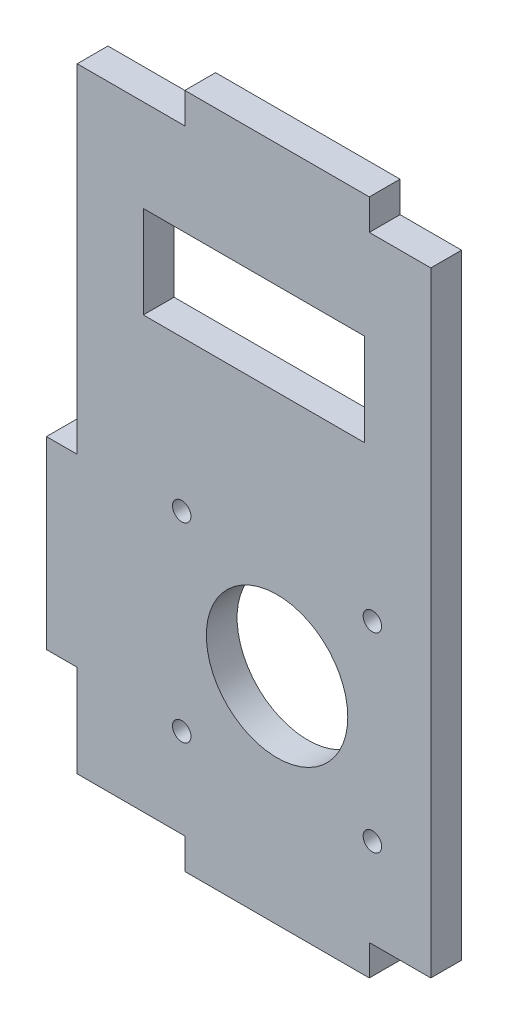
ISO-10303-21;
HEADER;
FILE_DESCRIPTION(('STEP AP214'),'2;1');
FILE_NAME('part.step','',(''),(''),'','','');
FILE_SCHEMA(('AUTOMOTIVE_DESIGN { 1 0 10303 214 1 1 1 1 }'));
ENDSEC;
DATA;
#1=APPLICATION_CONTEXT('core data for automotive mechanical design processes');
#2=APPLICATION_PROTOCOL_DEFINITION('international standard','automotive_design',2000,#1);
#3=PRODUCT_CONTEXT('',#1,'mechanical');
#4=PRODUCT('Part','Part','',(#3));
#5=PRODUCT_RELATED_PRODUCT_CATEGORY('part','',(#4));
#6=PRODUCT_DEFINITION_FORMATION('','',#4);
#7=PRODUCT_DEFINITION_CONTEXT('part definition',#1,'design');
#8=PRODUCT_DEFINITION('design','',#6,#7);
#9=PRODUCT_DEFINITION_SHAPE('','',#8);
#10=(LENGTH_UNIT() NAMED_UNIT(*) SI_UNIT(.MILLI.,.METRE.));
#11=(NAMED_UNIT(*) PLANE_ANGLE_UNIT() SI_UNIT($,.RADIAN.));
#12=(NAMED_UNIT(*) SI_UNIT($,.STERADIAN.) SOLID_ANGLE_UNIT());
#13=UNCERTAINTY_MEASURE_WITH_UNIT(LENGTH_MEASURE(1.E-05),#10,'distance_accuracy_value','');
#14=(GEOMETRIC_REPRESENTATION_CONTEXT(3) GLOBAL_UNCERTAINTY_ASSIGNED_CONTEXT((#13)) GLOBAL_UNIT_ASSIGNED_CONTEXT((#10,
#11,#12)) REPRESENTATION_CONTEXT('',''));
#15=CARTESIAN_POINT('',(0.,0.,0.));
#16=DIRECTION('',(0.,0.,1.));
#17=DIRECTION('',(1.,0.,0.));
#18=AXIS2_PLACEMENT_3D('',#15,#16,#17);
#19=CARTESIAN_POINT('',(0.,0.,5.));
#20=DIRECTION('',(0.,0.,-1.));
#21=DIRECTION('',(-1.,0.,0.));
#22=AXIS2_PLACEMENT_3D('',#19,#20,#21);
#23=PLANE('',#22);
#24=DIRECTION('',(0.,-1.,0.));
#25=VECTOR('',#24,1.);
#26=CARTESIAN_POINT('',(-7.50000000000001,15.,5.));
#27=LINE('',#26,#25);
#28=CARTESIAN_POINT('',(-7.50000000000001,45.,5.));
#29=VERTEX_POINT('',#28);
#30=CARTESIAN_POINT('',(-7.50000000000001,15.,5.));
#31=VERTEX_POINT('',#30);
#32=EDGE_CURVE('E230',#29,#31,#27,.T.);
#33=ORIENTED_EDGE('',*,*,#32,.T.);
#34=DIRECTION('',(1.,0.,0.));
#35=VECTOR('',#34,1.);
#36=CARTESIAN_POINT('',(-7.50000000000001,15.,5.));
#37=LINE('',#36,#35);
#38=CARTESIAN_POINT('',(-2.5,15.,5.));
#39=VERTEX_POINT('',#38);
#40=EDGE_CURVE('E234',#31,#39,#37,.T.);
#41=ORIENTED_EDGE('',*,*,#40,.T.);
#42=DIRECTION('',(0.,-1.,0.));
#43=VECTOR('',#42,1.);
#44=CARTESIAN_POINT('',(-2.5,15.,5.));
#45=LINE('',#44,#43);
#46=CARTESIAN_POINT('',(-2.49999999999999,0.,5.));
#47=VERTEX_POINT('',#46);
#48=EDGE_CURVE('E238',#39,#47,#45,.T.);
#49=ORIENTED_EDGE('',*,*,#48,.T.);
#50=DIRECTION('',(1.,0.,0.));
#51=VECTOR('',#50,1.);
#52=CARTESIAN_POINT('',(-2.49999999999999,0.,5.));
#53=LINE('',#52,#51);
#54=CARTESIAN_POINT('',(15.,0.,5.));
#55=VERTEX_POINT('',#54);
#56=EDGE_CURVE('E241',#47,#55,#53,.T.);
#57=ORIENTED_EDGE('',*,*,#56,.T.);
#58=DIRECTION('',(0.,-1.,0.));
#59=VECTOR('',#58,1.);
#60=CARTESIAN_POINT('',(15.,0.,5.));
#61=LINE('',#60,#59);
#62=CARTESIAN_POINT('',(15.,-5.,5.));
#63=VERTEX_POINT('',#62);
#64=EDGE_CURVE('E244',#55,#63,#61,.T.);
#65=ORIENTED_EDGE('',*,*,#64,.T.);
#66=DIRECTION('',(1.,0.,0.));
#67=VECTOR('',#66,1.);
#68=CARTESIAN_POINT('',(15.,-5.,5.));
#69=LINE('',#68,#67);
#70=CARTESIAN_POINT('',(45.,-5.,5.));
#71=VERTEX_POINT('',#70);
#72=EDGE_CURVE('E247',#63,#71,#69,.T.);
#73=ORIENTED_EDGE('',*,*,#72,.T.);
#74=DIRECTION('',(0.,1.,0.));
#75=VECTOR('',#74,1.);
#76=CARTESIAN_POINT('',(45.,0.,5.));
#77=LINE('',#76,#75);
#78=CARTESIAN_POINT('',(45.,0.,5.));
#79=VERTEX_POINT('',#78);
#80=EDGE_CURVE('E250',#71,#79,#77,.T.);
#81=ORIENTED_EDGE('',*,*,#80,.T.);
#82=DIRECTION('',(1.,0.,0.));
#83=VECTOR('',#82,1.);
#84=CARTESIAN_POINT('',(55.,0.,5.));
#85=LINE('',#84,#83);
#86=CARTESIAN_POINT('',(55.,0.,5.));
#87=VERTEX_POINT('',#86);
#88=EDGE_CURVE('E253',#79,#87,#85,.T.);
#89=ORIENTED_EDGE('',*,*,#88,.T.);
#90=DIRECTION('',(0.,1.,0.));
#91=VECTOR('',#90,1.);
#92=CARTESIAN_POINT('',(55.,100.,5.));
#93=LINE('',#92,#91);
#94=CARTESIAN_POINT('',(55.,100.,5.));
#95=VERTEX_POINT('',#94);
#96=EDGE_CURVE('E256',#87,#95,#93,.T.);
#97=ORIENTED_EDGE('',*,*,#96,.T.);
#98=DIRECTION('',(-1.,0.,0.));
#99=VECTOR('',#98,1.);
#100=CARTESIAN_POINT('',(45.,100.,5.));
#101=LINE('',#100,#99);
#102=CARTESIAN_POINT('',(45.,100.,5.));
#103=VERTEX_POINT('',#102);
#104=EDGE_CURVE('E259',#95,#103,#101,.T.);
#105=ORIENTED_EDGE('',*,*,#104,.T.);
#106=DIRECTION('',(0.,1.,0.));
#107=VECTOR('',#106,1.);
#108=CARTESIAN_POINT('',(45.,100.,5.));
#109=LINE('',#108,#107);
#110=CARTESIAN_POINT('',(45.,105.,5.));
#111=VERTEX_POINT('',#110);
#112=EDGE_CURVE('E262',#103,#111,#109,.T.);
#113=ORIENTED_EDGE('',*,*,#112,.T.);
#114=DIRECTION('',(-1.,0.,0.));
#115=VECTOR('',#114,1.);
#116=CARTESIAN_POINT('',(45.,105.,5.));
#117=LINE('',#116,#115);
#118=CARTESIAN_POINT('',(15.,105.,5.));
#119=VERTEX_POINT('',#118);
#120=EDGE_CURVE('E265',#111,#119,#117,.T.);
#121=ORIENTED_EDGE('',*,*,#120,.T.);
#122=DIRECTION('',(0.,-1.,0.));
#123=VECTOR('',#122,1.);
#124=CARTESIAN_POINT('',(15.,105.,5.));
#125=LINE('',#124,#123);
#126=CARTESIAN_POINT('',(15.,100.,5.));
#127=VERTEX_POINT('',#126);
#128=EDGE_CURVE('E268',#119,#127,#125,.T.);
#129=ORIENTED_EDGE('',*,*,#128,.T.);
#130=DIRECTION('',(-1.,0.,0.));
#131=VECTOR('',#130,1.);
#132=CARTESIAN_POINT('',(-2.5,100.,5.));
#133=LINE('',#132,#131);
#134=CARTESIAN_POINT('',(-2.5,100.,5.));
#135=VERTEX_POINT('',#134);
#136=EDGE_CURVE('E271',#127,#135,#133,.T.);
#137=ORIENTED_EDGE('',*,*,#136,.T.);
#138=DIRECTION('',(0.,-1.,0.));
#139=VECTOR('',#138,1.);
#140=CARTESIAN_POINT('',(-2.5,45.,5.));
#141=LINE('',#140,#139);
#142=CARTESIAN_POINT('',(-2.5,45.,5.));
#143=VERTEX_POINT('',#142);
#144=EDGE_CURVE('E274',#135,#143,#141,.T.);
#145=ORIENTED_EDGE('',*,*,#144,.T.);
#146=DIRECTION('',(-1.,0.,0.));
#147=VECTOR('',#146,1.);
#148=CARTESIAN_POINT('',(-7.50000000000001,45.,5.));
#149=LINE('',#148,#147);
#150=EDGE_CURVE('E277',#143,#29,#149,.T.);
#151=ORIENTED_EDGE('',*,*,#150,.T.);
#152=EDGE_LOOP('',(#33,#41,#49,#57,#65,#73,#81,#89,#97,#105,#113,#121,#129,#137,#145,#151));
#153=FACE_BOUND('',#152,.T.);
#154=DIRECTION('',(0.,-1.,0.));
#155=VECTOR('',#154,1.);
#156=CARTESIAN_POINT('',(8.24999999999999,85.,5.));
#157=LINE('',#156,#155);
#158=CARTESIAN_POINT('',(8.24999999999999,85.,5.));
#159=VERTEX_POINT('',#158);
#160=CARTESIAN_POINT('',(8.24999999999999,70.,5.));
#161=VERTEX_POINT('',#160);
#162=EDGE_CURVE('E179',#159,#161,#157,.T.);
#163=ORIENTED_EDGE('',*,*,#162,.F.);
#164=DIRECTION('',(-1.,0.,0.));
#165=VECTOR('',#164,1.);
#166=CARTESIAN_POINT('',(8.24999999999999,85.,5.));
#167=LINE('',#166,#165);
#168=CARTESIAN_POINT('',(44.25,85.,5.));
#169=VERTEX_POINT('',#168);
#170=EDGE_CURVE('E206',#169,#159,#167,.T.);
#171=ORIENTED_EDGE('',*,*,#170,.F.);
#172=DIRECTION('',(0.,1.,0.));
#173=VECTOR('',#172,1.);
#174=CARTESIAN_POINT('',(44.25,85.,5.));
#175=LINE('',#174,#173);
#176=CARTESIAN_POINT('',(44.25,70.,5.));
#177=VERTEX_POINT('',#176);
#178=EDGE_CURVE('E202',#177,#169,#175,.T.);
#179=ORIENTED_EDGE('',*,*,#178,.F.);
#180=DIRECTION('',(1.,0.,0.));
#181=VECTOR('',#180,1.);
#182=CARTESIAN_POINT('',(8.24999999999999,70.,5.));
#183=LINE('',#182,#181);
#184=EDGE_CURVE('E188',#161,#177,#183,.T.);
#185=ORIENTED_EDGE('',*,*,#184,.F.);
#186=EDGE_LOOP('',(#163,#171,#179,#185));
#187=FACE_BOUND('',#186,.T.);
#188=CARTESIAN_POINT('',(30.,30.,5.));
#189=DIRECTION('',(0.,0.,1.));
#190=DIRECTION('',(1.,0.,0.));
#191=AXIS2_PLACEMENT_3D('',#188,#189,#190);
#192=CIRCLE('',#191,11.5);
#193=CARTESIAN_POINT('',(41.5,30.,5.));
#194=VERTEX_POINT('',#193);
#195=EDGE_CURVE('E214',#194,#194,#192,.T.);
#196=ORIENTED_EDGE('',*,*,#195,.F.);
#197=EDGE_LOOP('',(#196));
#198=FACE_BOUND('',#197,.T.);
#199=CARTESIAN_POINT('',(14.5,45.5,5.));
#200=DIRECTION('',(0.,0.,1.));
#201=DIRECTION('',(1.,0.,0.));
#202=AXIS2_PLACEMENT_3D('',#199,#200,#201);
#203=CIRCLE('',#202,1.5);
#204=CARTESIAN_POINT('',(16.,45.5,5.));
#205=VERTEX_POINT('',#204);
#206=EDGE_CURVE('E723',#205,#205,#203,.T.);
#207=ORIENTED_EDGE('',*,*,#206,.F.);
#208=EDGE_LOOP('',(#207));
#209=FACE_BOUND('',#208,.T.);
#210=CARTESIAN_POINT('',(45.5,45.5,5.));
#211=DIRECTION('',(0.,0.,1.));
#212=DIRECTION('',(1.,0.,0.));
#213=AXIS2_PLACEMENT_3D('',#210,#211,#212);
#214=CIRCLE('',#213,1.5);
#215=CARTESIAN_POINT('',(47.,45.5,5.));
#216=VERTEX_POINT('',#215);
#217=EDGE_CURVE('E715',#216,#216,#214,.T.);
#218=ORIENTED_EDGE('',*,*,#217,.F.);
#219=EDGE_LOOP('',(#218));
#220=FACE_BOUND('',#219,.T.);
#221=CARTESIAN_POINT('',(45.5,14.5,5.));
#222=DIRECTION('',(0.,0.,1.));
#223=DIRECTION('',(1.,0.,0.));
#224=AXIS2_PLACEMENT_3D('',#221,#222,#223);
#225=CIRCLE('',#224,1.5);
#226=CARTESIAN_POINT('',(47.,14.5,5.));
#227=VERTEX_POINT('',#226);
#228=EDGE_CURVE('E707',#227,#227,#225,.T.);
#229=ORIENTED_EDGE('',*,*,#228,.F.);
#230=EDGE_LOOP('',(#229));
#231=FACE_BOUND('',#230,.T.);
#232=CARTESIAN_POINT('',(14.5,14.5,5.));
#233=DIRECTION('',(0.,0.,1.));
#234=DIRECTION('',(1.,0.,0.));
#235=AXIS2_PLACEMENT_3D('',#232,#233,#234);
#236=CIRCLE('',#235,1.5);
#237=CARTESIAN_POINT('',(16.,14.5,5.));
#238=VERTEX_POINT('',#237);
#239=EDGE_CURVE('E696',#238,#238,#236,.T.);
#240=ORIENTED_EDGE('',*,*,#239,.F.);
#241=EDGE_LOOP('',(#240));
#242=FACE_BOUND('',#241,.T.);
#243=ADVANCED_FACE('F41',(#153,#187,#198,#209,#220,#231,#242),#23,.F.);
#244=CARTESIAN_POINT('',(0.,0.,0.));
#245=DIRECTION('',(0.,0.,-1.));
#246=DIRECTION('',(-1.,0.,0.));
#247=AXIS2_PLACEMENT_3D('',#244,#245,#246);
#248=PLANE('',#247);
#249=CARTESIAN_POINT('',(45.5,14.5,0.));
#250=DIRECTION('',(0.,0.,1.));
#251=DIRECTION('',(1.,0.,0.));
#252=AXIS2_PLACEMENT_3D('',#249,#250,#251);
#253=CIRCLE('',#252,1.5);
#254=CARTESIAN_POINT('',(47.,14.5,0.));
#255=VERTEX_POINT('',#254);
#256=EDGE_CURVE('E704',#255,#255,#253,.T.);
#257=ORIENTED_EDGE('',*,*,#256,.T.);
#258=EDGE_LOOP('',(#257));
#259=FACE_BOUND('',#258,.T.);
#260=CARTESIAN_POINT('',(14.5,45.5,0.));
#261=DIRECTION('',(0.,0.,1.));
#262=DIRECTION('',(1.,0.,0.));
#263=AXIS2_PLACEMENT_3D('',#260,#261,#262);
#264=CIRCLE('',#263,1.5);
#265=CARTESIAN_POINT('',(16.,45.5,0.));
#266=VERTEX_POINT('',#265);
#267=EDGE_CURVE('E719',#266,#266,#264,.T.);
#268=ORIENTED_EDGE('',*,*,#267,.T.);
#269=EDGE_LOOP('',(#268));
#270=FACE_BOUND('',#269,.T.);
#271=DIRECTION('',(-1.,0.,0.));
#272=VECTOR('',#271,1.);
#273=CARTESIAN_POINT('',(8.24999999999999,85.,0.));
#274=LINE('',#273,#272);
#275=CARTESIAN_POINT('',(44.25,85.,0.));
#276=VERTEX_POINT('',#275);
#277=CARTESIAN_POINT('',(8.24999999999999,85.,0.));
#278=VERTEX_POINT('',#277);
#279=EDGE_CURVE('E189',#276,#278,#274,.T.);
#280=ORIENTED_EDGE('',*,*,#279,.T.);
#281=DIRECTION('',(0.,-1.,0.));
#282=VECTOR('',#281,1.);
#283=CARTESIAN_POINT('',(8.24999999999999,85.,0.));
#284=LINE('',#283,#282);
#285=CARTESIAN_POINT('',(8.24999999999999,70.,0.));
#286=VERTEX_POINT('',#285);
#287=EDGE_CURVE('E65',#278,#286,#284,.T.);
#288=ORIENTED_EDGE('',*,*,#287,.T.);
#289=DIRECTION('',(1.,0.,0.));
#290=VECTOR('',#289,1.);
#291=CARTESIAN_POINT('',(8.24999999999999,70.,0.));
#292=LINE('',#291,#290);
#293=CARTESIAN_POINT('',(44.25,70.,0.));
#294=VERTEX_POINT('',#293);
#295=EDGE_CURVE('E195',#286,#294,#292,.T.);
#296=ORIENTED_EDGE('',*,*,#295,.T.);
#297=DIRECTION('',(0.,1.,0.));
#298=VECTOR('',#297,1.);
#299=CARTESIAN_POINT('',(44.25,85.,0.));
#300=LINE('',#299,#298);
#301=EDGE_CURVE('E217',#294,#276,#300,.T.);
#302=ORIENTED_EDGE('',*,*,#301,.T.);
#303=EDGE_LOOP('',(#280,#288,#296,#302));
#304=FACE_BOUND('',#303,.T.);
#305=DIRECTION('',(0.,-1.,0.));
#306=VECTOR('',#305,1.);
#307=CARTESIAN_POINT('',(-7.50000000000001,15.,0.));
#308=LINE('',#307,#306);
#309=CARTESIAN_POINT('',(-7.50000000000001,45.,0.));
#310=VERTEX_POINT('',#309);
#311=CARTESIAN_POINT('',(-7.50000000000001,15.,0.));
#312=VERTEX_POINT('',#311);
#313=EDGE_CURVE('E197',#310,#312,#308,.T.);
#314=ORIENTED_EDGE('',*,*,#313,.F.);
#315=DIRECTION('',(-1.,0.,0.));
#316=VECTOR('',#315,1.);
#317=CARTESIAN_POINT('',(-7.50000000000001,45.,0.));
#318=LINE('',#317,#316);
#319=CARTESIAN_POINT('',(-2.5,45.,0.));
#320=VERTEX_POINT('',#319);
#321=EDGE_CURVE('E235',#320,#310,#318,.T.);
#322=ORIENTED_EDGE('',*,*,#321,.F.);
#323=DIRECTION('',(0.,-1.,0.));
#324=VECTOR('',#323,1.);
#325=CARTESIAN_POINT('',(-2.5,45.,0.));
#326=LINE('',#325,#324);
#327=CARTESIAN_POINT('',(-2.5,100.,0.));
#328=VERTEX_POINT('',#327);
#329=EDGE_CURVE('E323',#328,#320,#326,.T.);
#330=ORIENTED_EDGE('',*,*,#329,.F.);
#331=DIRECTION('',(-1.,0.,0.));
#332=VECTOR('',#331,1.);
#333=CARTESIAN_POINT('',(-2.5,100.,0.));
#334=LINE('',#333,#332);
#335=CARTESIAN_POINT('',(15.,100.,0.));
#336=VERTEX_POINT('',#335);
#337=EDGE_CURVE('E320',#336,#328,#334,.T.);
#338=ORIENTED_EDGE('',*,*,#337,.F.);
#339=DIRECTION('',(0.,-1.,0.));
#340=VECTOR('',#339,1.);
#341=CARTESIAN_POINT('',(15.,105.,0.));
#342=LINE('',#341,#340);
#343=CARTESIAN_POINT('',(15.,105.,0.));
#344=VERTEX_POINT('',#343);
#345=EDGE_CURVE('E317',#344,#336,#342,.T.);
#346=ORIENTED_EDGE('',*,*,#345,.F.);
#347=DIRECTION('',(-1.,0.,0.));
#348=VECTOR('',#347,1.);
#349=CARTESIAN_POINT('',(45.,105.,0.));
#350=LINE('',#349,#348);
#351=CARTESIAN_POINT('',(45.,105.,0.));
#352=VERTEX_POINT('',#351);
#353=EDGE_CURVE('E314',#352,#344,#350,.T.);
#354=ORIENTED_EDGE('',*,*,#353,.F.);
#355=DIRECTION('',(0.,1.,0.));
#356=VECTOR('',#355,1.);
#357=CARTESIAN_POINT('',(45.,100.,0.));
#358=LINE('',#357,#356);
#359=CARTESIAN_POINT('',(45.,100.,0.));
#360=VERTEX_POINT('',#359);
#361=EDGE_CURVE('E311',#360,#352,#358,.T.);
#362=ORIENTED_EDGE('',*,*,#361,.F.);
#363=DIRECTION('',(-1.,0.,0.));
#364=VECTOR('',#363,1.);
#365=CARTESIAN_POINT('',(45.,100.,0.));
#366=LINE('',#365,#364);
#367=CARTESIAN_POINT('',(55.,100.,0.));
#368=VERTEX_POINT('',#367);
#369=EDGE_CURVE('E308',#368,#360,#366,.T.);
#370=ORIENTED_EDGE('',*,*,#369,.F.);
#371=DIRECTION('',(0.,1.,0.));
#372=VECTOR('',#371,1.);
#373=CARTESIAN_POINT('',(55.,100.,0.));
#374=LINE('',#373,#372);
#375=CARTESIAN_POINT('',(55.,0.,0.));
#376=VERTEX_POINT('',#375);
#377=EDGE_CURVE('E305',#376,#368,#374,.T.);
#378=ORIENTED_EDGE('',*,*,#377,.F.);
#379=DIRECTION('',(1.,0.,0.));
#380=VECTOR('',#379,1.);
#381=CARTESIAN_POINT('',(55.,0.,0.));
#382=LINE('',#381,#380);
#383=CARTESIAN_POINT('',(45.,0.,0.));
#384=VERTEX_POINT('',#383);
#385=EDGE_CURVE('E302',#384,#376,#382,.T.);
#386=ORIENTED_EDGE('',*,*,#385,.F.);
#387=DIRECTION('',(0.,1.,0.));
#388=VECTOR('',#387,1.);
#389=CARTESIAN_POINT('',(45.,0.,0.));
#390=LINE('',#389,#388);
#391=CARTESIAN_POINT('',(45.,-5.,0.));
#392=VERTEX_POINT('',#391);
#393=EDGE_CURVE('E299',#392,#384,#390,.T.);
#394=ORIENTED_EDGE('',*,*,#393,.F.);
#395=DIRECTION('',(1.,0.,0.));
#396=VECTOR('',#395,1.);
#397=CARTESIAN_POINT('',(15.,-5.,0.));
#398=LINE('',#397,#396);
#399=CARTESIAN_POINT('',(15.,-5.,0.));
#400=VERTEX_POINT('',#399);
#401=EDGE_CURVE('E296',#400,#392,#398,.T.);
#402=ORIENTED_EDGE('',*,*,#401,.F.);
#403=DIRECTION('',(0.,-1.,0.));
#404=VECTOR('',#403,1.);
#405=CARTESIAN_POINT('',(15.,0.,0.));
#406=LINE('',#405,#404);
#407=CARTESIAN_POINT('',(15.,0.,0.));
#408=VERTEX_POINT('',#407);
#409=EDGE_CURVE('E293',#408,#400,#406,.T.);
#410=ORIENTED_EDGE('',*,*,#409,.F.);
#411=DIRECTION('',(1.,0.,0.));
#412=VECTOR('',#411,1.);
#413=CARTESIAN_POINT('',(-2.49999999999999,0.,0.));
#414=LINE('',#413,#412);
#415=CARTESIAN_POINT('',(-2.49999999999999,0.,0.));
#416=VERTEX_POINT('',#415);
#417=EDGE_CURVE('E290',#416,#408,#414,.T.);
#418=ORIENTED_EDGE('',*,*,#417,.F.);
#419=DIRECTION('',(0.,-1.,0.));
#420=VECTOR('',#419,1.);
#421=CARTESIAN_POINT('',(-2.5,15.,0.));
#422=LINE('',#421,#420);
#423=CARTESIAN_POINT('',(-2.5,15.,0.));
#424=VERTEX_POINT('',#423);
#425=EDGE_CURVE('E287',#424,#416,#422,.T.);
#426=ORIENTED_EDGE('',*,*,#425,.F.);
#427=DIRECTION('',(1.,0.,0.));
#428=VECTOR('',#427,1.);
#429=CARTESIAN_POINT('',(-7.50000000000001,15.,0.));
#430=LINE('',#429,#428);
#431=EDGE_CURVE('E284',#312,#424,#430,.T.);
#432=ORIENTED_EDGE('',*,*,#431,.F.);
#433=EDGE_LOOP('',(#314,#322,#330,#338,#346,#354,#362,#370,#378,#386,#394,#402,#410,#418,#426,#432));
#434=FACE_BOUND('',#433,.T.);
#435=CARTESIAN_POINT('',(30.,30.,0.));
#436=DIRECTION('',(0.,0.,1.));
#437=DIRECTION('',(1.,0.,0.));
#438=AXIS2_PLACEMENT_3D('',#435,#436,#437);
#439=CIRCLE('',#438,11.5);
#440=CARTESIAN_POINT('',(41.5,30.,0.));
#441=VERTEX_POINT('',#440);
#442=EDGE_CURVE('E727',#441,#441,#439,.T.);
#443=ORIENTED_EDGE('',*,*,#442,.T.);
#444=EDGE_LOOP('',(#443));
#445=FACE_BOUND('',#444,.T.);
#446=CARTESIAN_POINT('',(45.5,45.5,0.));
#447=DIRECTION('',(0.,0.,1.));
#448=DIRECTION('',(1.,0.,0.));
#449=AXIS2_PLACEMENT_3D('',#446,#447,#448);
#450=CIRCLE('',#449,1.5);
#451=CARTESIAN_POINT('',(47.,45.5,0.));
#452=VERTEX_POINT('',#451);
#453=EDGE_CURVE('E711',#452,#452,#450,.T.);
#454=ORIENTED_EDGE('',*,*,#453,.T.);
#455=EDGE_LOOP('',(#454));
#456=FACE_BOUND('',#455,.T.);
#457=CARTESIAN_POINT('',(14.5,14.5,0.));
#458=DIRECTION('',(0.,0.,1.));
#459=DIRECTION('',(1.,0.,0.));
#460=AXIS2_PLACEMENT_3D('',#457,#458,#459);
#461=CIRCLE('',#460,1.5);
#462=CARTESIAN_POINT('',(16.,14.5,0.));
#463=VERTEX_POINT('',#462);
#464=EDGE_CURVE('E699',#463,#463,#461,.T.);
#465=ORIENTED_EDGE('',*,*,#464,.T.);
#466=EDGE_LOOP('',(#465));
#467=FACE_BOUND('',#466,.T.);
#468=ADVANCED_FACE('F394',(#259,#270,#304,#434,#445,#456,#467),#248,.T.);
#469=CARTESIAN_POINT('',(-7.50000000000001,15.,5.));
#470=DIRECTION('',(1.,0.,0.));
#471=DIRECTION('',(0.,0.,-1.));
#472=AXIS2_PLACEMENT_3D('',#469,#470,#471);
#473=PLANE('',#472);
#474=ORIENTED_EDGE('',*,*,#313,.T.);
#475=DIRECTION('',(0.,0.,-1.));
#476=VECTOR('',#475,1.);
#477=CARTESIAN_POINT('',(-7.50000000000001,15.,5.));
#478=LINE('',#477,#476);
#479=EDGE_CURVE('E11',#31,#312,#478,.T.);
#480=ORIENTED_EDGE('',*,*,#479,.F.);
#481=ORIENTED_EDGE('',*,*,#32,.F.);
#482=DIRECTION('',(0.,0.,-1.));
#483=VECTOR('',#482,1.);
#484=CARTESIAN_POINT('',(-7.50000000000001,45.,5.));
#485=LINE('',#484,#483);
#486=EDGE_CURVE('E280',#29,#310,#485,.T.);
#487=ORIENTED_EDGE('',*,*,#486,.T.);
#488=EDGE_LOOP('',(#474,#480,#481,#487));
#489=FACE_BOUND('',#488,.T.);
#490=ADVANCED_FACE('F43',(#489),#473,.F.);
#491=CARTESIAN_POINT('',(-7.50000000000001,15.,5.));
#492=DIRECTION('',(0.,1.,0.));
#493=DIRECTION('',(0.,0.,1.));
#494=AXIS2_PLACEMENT_3D('',#491,#492,#493);
#495=PLANE('',#494);
#496=ORIENTED_EDGE('',*,*,#431,.T.);
#497=DIRECTION('',(0.,0.,-1.));
#498=VECTOR('',#497,1.);
#499=CARTESIAN_POINT('',(-2.5,15.,5.));
#500=LINE('',#499,#498);
#501=EDGE_CURVE('E50',#39,#424,#500,.T.);
#502=ORIENTED_EDGE('',*,*,#501,.F.);
#503=ORIENTED_EDGE('',*,*,#40,.F.);
#504=ORIENTED_EDGE('',*,*,#479,.T.);
#505=EDGE_LOOP('',(#496,#502,#503,#504));
#506=FACE_BOUND('',#505,.T.);
#507=ADVANCED_FACE('F411',(#506),#495,.F.);
#508=CARTESIAN_POINT('',(-2.5,15.,5.));
#509=DIRECTION('',(1.,0.,0.));
#510=DIRECTION('',(0.,1.,0.));
#511=AXIS2_PLACEMENT_3D('',#508,#509,#510);
#512=PLANE('',#511);
#513=ORIENTED_EDGE('',*,*,#425,.T.);
#514=DIRECTION('',(0.,0.,-1.));
#515=VECTOR('',#514,1.);
#516=CARTESIAN_POINT('',(-2.49999999999999,0.,5.));
#517=LINE('',#516,#515);
#518=EDGE_CURVE('E379',#47,#416,#517,.T.);
#519=ORIENTED_EDGE('',*,*,#518,.F.);
#520=ORIENTED_EDGE('',*,*,#48,.F.);
#521=ORIENTED_EDGE('',*,*,#501,.T.);
#522=EDGE_LOOP('',(#513,#519,#520,#521));
#523=FACE_BOUND('',#522,.T.);
#524=ADVANCED_FACE('F388',(#523),#512,.F.);
#525=CARTESIAN_POINT('',(-2.49999999999999,0.,5.));
#526=DIRECTION('',(0.,1.,0.));
#527=DIRECTION('',(-1.,0.,0.));
#528=AXIS2_PLACEMENT_3D('',#525,#526,#527);
#529=PLANE('',#528);
#530=ORIENTED_EDGE('',*,*,#417,.T.);
#531=DIRECTION('',(0.,0.,-1.));
#532=VECTOR('',#531,1.);
#533=CARTESIAN_POINT('',(15.,0.,5.));
#534=LINE('',#533,#532);
#535=EDGE_CURVE('E375',#55,#408,#534,.T.);
#536=ORIENTED_EDGE('',*,*,#535,.F.);
#537=ORIENTED_EDGE('',*,*,#56,.F.);
#538=ORIENTED_EDGE('',*,*,#518,.T.);
#539=EDGE_LOOP('',(#530,#536,#537,#538));
#540=FACE_BOUND('',#539,.T.);
#541=ADVANCED_FACE('F400',(#540),#529,.F.);
#542=CARTESIAN_POINT('',(15.,0.,5.));
#543=DIRECTION('',(1.,0.,0.));
#544=DIRECTION('',(0.,0.,-1.));
#545=AXIS2_PLACEMENT_3D('',#542,#543,#544);
#546=PLANE('',#545);
#547=ORIENTED_EDGE('',*,*,#409,.T.);
#548=DIRECTION('',(0.,0.,-1.));
#549=VECTOR('',#548,1.);
#550=CARTESIAN_POINT('',(15.,-5.,5.));
#551=LINE('',#550,#549);
#552=EDGE_CURVE('E371',#63,#400,#551,.T.);
#553=ORIENTED_EDGE('',*,*,#552,.F.);
#554=ORIENTED_EDGE('',*,*,#64,.F.);
#555=ORIENTED_EDGE('',*,*,#535,.T.);
#556=EDGE_LOOP('',(#547,#553,#554,#555));
#557=FACE_BOUND('',#556,.T.);
#558=ADVANCED_FACE('F404',(#557),#546,.F.);
#559=CARTESIAN_POINT('',(15.,-5.,5.));
#560=DIRECTION('',(0.,1.,0.));
#561=DIRECTION('',(0.,0.,1.));
#562=AXIS2_PLACEMENT_3D('',#559,#560,#561);
#563=PLANE('',#562);
#564=ORIENTED_EDGE('',*,*,#401,.T.);
#565=DIRECTION('',(0.,0.,-1.));
#566=VECTOR('',#565,1.);
#567=CARTESIAN_POINT('',(45.,-5.,5.));
#568=LINE('',#567,#566);
#569=EDGE_CURVE('E367',#71,#392,#568,.T.);
#570=ORIENTED_EDGE('',*,*,#569,.F.);
#571=ORIENTED_EDGE('',*,*,#72,.F.);
#572=ORIENTED_EDGE('',*,*,#552,.T.);
#573=EDGE_LOOP('',(#564,#570,#571,#572));
#574=FACE_BOUND('',#573,.T.);
#575=ADVANCED_FACE('F464',(#574),#563,.F.);
#576=CARTESIAN_POINT('',(45.,0.,5.));
#577=DIRECTION('',(-1.,0.,0.));
#578=DIRECTION('',(0.,0.,1.));
#579=AXIS2_PLACEMENT_3D('',#576,#577,#578);
#580=PLANE('',#579);
#581=ORIENTED_EDGE('',*,*,#393,.T.);
#582=DIRECTION('',(0.,0.,-1.));
#583=VECTOR('',#582,1.);
#584=CARTESIAN_POINT('',(45.,0.,5.));
#585=LINE('',#584,#583);
#586=EDGE_CURVE('E363',#79,#384,#585,.T.);
#587=ORIENTED_EDGE('',*,*,#586,.F.);
#588=ORIENTED_EDGE('',*,*,#80,.F.);
#589=ORIENTED_EDGE('',*,*,#569,.T.);
#590=EDGE_LOOP('',(#581,#587,#588,#589));
#591=FACE_BOUND('',#590,.T.);
#592=ADVANCED_FACE('F461',(#591),#580,.F.);
#593=CARTESIAN_POINT('',(55.,0.,5.));
#594=DIRECTION('',(0.,1.,0.));
#595=DIRECTION('',(0.,0.,1.));
#596=AXIS2_PLACEMENT_3D('',#593,#594,#595);
#597=PLANE('',#596);
#598=ORIENTED_EDGE('',*,*,#385,.T.);
#599=DIRECTION('',(0.,0.,-1.));
#600=VECTOR('',#599,1.);
#601=CARTESIAN_POINT('',(55.,0.,5.));
#602=LINE('',#601,#600);
#603=EDGE_CURVE('E359',#87,#376,#602,.T.);
#604=ORIENTED_EDGE('',*,*,#603,.F.);
#605=ORIENTED_EDGE('',*,*,#88,.F.);
#606=ORIENTED_EDGE('',*,*,#586,.T.);
#607=EDGE_LOOP('',(#598,#604,#605,#606));
#608=FACE_BOUND('',#607,.T.);
#609=ADVANCED_FACE('F457',(#608),#597,.F.);
#610=CARTESIAN_POINT('',(55.,100.,5.));
#611=DIRECTION('',(-1.,0.,0.));
#612=DIRECTION('',(0.,-1.,0.));
#613=AXIS2_PLACEMENT_3D('',#610,#611,#612);
#614=PLANE('',#613);
#615=ORIENTED_EDGE('',*,*,#377,.T.);
#616=DIRECTION('',(0.,0.,-1.));
#617=VECTOR('',#616,1.);
#618=CARTESIAN_POINT('',(55.,100.,5.));
#619=LINE('',#618,#617);
#620=EDGE_CURVE('E355',#95,#368,#619,.T.);
#621=ORIENTED_EDGE('',*,*,#620,.F.);
#622=ORIENTED_EDGE('',*,*,#96,.F.);
#623=ORIENTED_EDGE('',*,*,#603,.T.);
#624=EDGE_LOOP('',(#615,#621,#622,#623));
#625=FACE_BOUND('',#624,.T.);
#626=ADVANCED_FACE('F453',(#625),#614,.F.);
#627=CARTESIAN_POINT('',(45.,100.,5.));
#628=DIRECTION('',(0.,-1.,0.));
#629=DIRECTION('',(0.,0.,-1.));
#630=AXIS2_PLACEMENT_3D('',#627,#628,#629);
#631=PLANE('',#630);
#632=ORIENTED_EDGE('',*,*,#369,.T.);
#633=DIRECTION('',(0.,0.,-1.));
#634=VECTOR('',#633,1.);
#635=CARTESIAN_POINT('',(45.,100.,5.));
#636=LINE('',#635,#634);
#637=EDGE_CURVE('E351',#103,#360,#636,.T.);
#638=ORIENTED_EDGE('',*,*,#637,.F.);
#639=ORIENTED_EDGE('',*,*,#104,.F.);
#640=ORIENTED_EDGE('',*,*,#620,.T.);
#641=EDGE_LOOP('',(#632,#638,#639,#640));
#642=FACE_BOUND('',#641,.T.);
#643=ADVANCED_FACE('F448',(#642),#631,.F.);
#644=CARTESIAN_POINT('',(45.,100.,5.));
#645=DIRECTION('',(-1.,0.,0.));
#646=DIRECTION('',(0.,0.,1.));
#647=AXIS2_PLACEMENT_3D('',#644,#645,#646);
#648=PLANE('',#647);
#649=ORIENTED_EDGE('',*,*,#361,.T.);
#650=DIRECTION('',(0.,0.,-1.));
#651=VECTOR('',#650,1.);
#652=CARTESIAN_POINT('',(45.,105.,5.));
#653=LINE('',#652,#651);
#654=EDGE_CURVE('E347',#111,#352,#653,.T.);
#655=ORIENTED_EDGE('',*,*,#654,.F.);
#656=ORIENTED_EDGE('',*,*,#112,.F.);
#657=ORIENTED_EDGE('',*,*,#637,.T.);
#658=EDGE_LOOP('',(#649,#655,#656,#657));
#659=FACE_BOUND('',#658,.T.);
#660=ADVANCED_FACE('F442',(#659),#648,.F.);
#661=CARTESIAN_POINT('',(45.,105.,5.));
#662=DIRECTION('',(0.,-1.,0.));
#663=DIRECTION('',(0.,0.,-1.));
#664=AXIS2_PLACEMENT_3D('',#661,#662,#663);
#665=PLANE('',#664);
#666=ORIENTED_EDGE('',*,*,#353,.T.);
#667=DIRECTION('',(0.,0.,-1.));
#668=VECTOR('',#667,1.);
#669=CARTESIAN_POINT('',(15.,105.,5.));
#670=LINE('',#669,#668);
#671=EDGE_CURVE('E343',#119,#344,#670,.T.);
#672=ORIENTED_EDGE('',*,*,#671,.F.);
#673=ORIENTED_EDGE('',*,*,#120,.F.);
#674=ORIENTED_EDGE('',*,*,#654,.T.);
#675=EDGE_LOOP('',(#666,#672,#673,#674));
#676=FACE_BOUND('',#675,.T.);
#677=ADVANCED_FACE('F438',(#676),#665,.F.);
#678=CARTESIAN_POINT('',(15.,105.,5.));
#679=DIRECTION('',(1.,0.,0.));
#680=DIRECTION('',(0.,0.,-1.));
#681=AXIS2_PLACEMENT_3D('',#678,#679,#680);
#682=PLANE('',#681);
#683=ORIENTED_EDGE('',*,*,#345,.T.);
#684=DIRECTION('',(0.,0.,-1.));
#685=VECTOR('',#684,1.);
#686=CARTESIAN_POINT('',(15.,100.,5.));
#687=LINE('',#686,#685);
#688=EDGE_CURVE('E339',#127,#336,#687,.T.);
#689=ORIENTED_EDGE('',*,*,#688,.F.);
#690=ORIENTED_EDGE('',*,*,#128,.F.);
#691=ORIENTED_EDGE('',*,*,#671,.T.);
#692=EDGE_LOOP('',(#683,#689,#690,#691));
#693=FACE_BOUND('',#692,.T.);
#694=ADVANCED_FACE('F433',(#693),#682,.F.);
#695=CARTESIAN_POINT('',(-2.5,100.,5.));
#696=DIRECTION('',(0.,-1.,0.));
#697=DIRECTION('',(0.,0.,-1.));
#698=AXIS2_PLACEMENT_3D('',#695,#696,#697);
#699=PLANE('',#698);
#700=ORIENTED_EDGE('',*,*,#337,.T.);
#701=DIRECTION('',(0.,0.,-1.));
#702=VECTOR('',#701,1.);
#703=CARTESIAN_POINT('',(-2.5,100.,5.));
#704=LINE('',#703,#702);
#705=EDGE_CURVE('E335',#135,#328,#704,.T.);
#706=ORIENTED_EDGE('',*,*,#705,.F.);
#707=ORIENTED_EDGE('',*,*,#136,.F.);
#708=ORIENTED_EDGE('',*,*,#688,.T.);
#709=EDGE_LOOP('',(#700,#706,#707,#708));
#710=FACE_BOUND('',#709,.T.);
#711=ADVANCED_FACE('F427',(#710),#699,.F.);
#712=CARTESIAN_POINT('',(-2.5,45.,5.));
#713=DIRECTION('',(1.,0.,0.));
#714=DIRECTION('',(0.,1.,0.));
#715=AXIS2_PLACEMENT_3D('',#712,#713,#714);
#716=PLANE('',#715);
#717=ORIENTED_EDGE('',*,*,#329,.T.);
#718=DIRECTION('',(0.,0.,-1.));
#719=VECTOR('',#718,1.);
#720=CARTESIAN_POINT('',(-2.5,45.,5.));
#721=LINE('',#720,#719);
#722=EDGE_CURVE('E331',#143,#320,#721,.T.);
#723=ORIENTED_EDGE('',*,*,#722,.F.);
#724=ORIENTED_EDGE('',*,*,#144,.F.);
#725=ORIENTED_EDGE('',*,*,#705,.T.);
#726=EDGE_LOOP('',(#717,#723,#724,#725));
#727=FACE_BOUND('',#726,.T.);
#728=ADVANCED_FACE('F423',(#727),#716,.F.);
#729=CARTESIAN_POINT('',(-7.50000000000001,45.,5.));
#730=DIRECTION('',(0.,-1.,0.));
#731=DIRECTION('',(0.,0.,-1.));
#732=AXIS2_PLACEMENT_3D('',#729,#730,#731);
#733=PLANE('',#732);
#734=ORIENTED_EDGE('',*,*,#321,.T.);
#735=ORIENTED_EDGE('',*,*,#486,.F.);
#736=ORIENTED_EDGE('',*,*,#150,.F.);
#737=ORIENTED_EDGE('',*,*,#722,.T.);
#738=EDGE_LOOP('',(#734,#735,#736,#737));
#739=FACE_BOUND('',#738,.T.);
#740=ADVANCED_FACE('F418',(#739),#733,.F.);
#741=CARTESIAN_POINT('',(8.24999999999999,85.,5.));
#742=DIRECTION('',(1.,0.,0.));
#743=DIRECTION('',(0.,1.,0.));
#744=AXIS2_PLACEMENT_3D('',#741,#742,#743);
#745=PLANE('',#744);
#746=ORIENTED_EDGE('',*,*,#287,.F.);
#747=DIRECTION('',(0.,0.,-1.));
#748=VECTOR('',#747,1.);
#749=CARTESIAN_POINT('',(8.24999999999999,85.,5.));
#750=LINE('',#749,#748);
#751=EDGE_CURVE('E183',#159,#278,#750,.T.);
#752=ORIENTED_EDGE('',*,*,#751,.F.);
#753=ORIENTED_EDGE('',*,*,#162,.T.);
#754=DIRECTION('',(0.,0.,-1.));
#755=VECTOR('',#754,1.);
#756=CARTESIAN_POINT('',(8.24999999999999,70.,5.));
#757=LINE('',#756,#755);
#758=EDGE_CURVE('E182',#161,#286,#757,.T.);
#759=ORIENTED_EDGE('',*,*,#758,.T.);
#760=EDGE_LOOP('',(#746,#752,#753,#759));
#761=FACE_BOUND('',#760,.T.);
#762=ADVANCED_FACE('F181',(#761),#745,.T.);
#763=CARTESIAN_POINT('',(8.24999999999999,70.,5.));
#764=DIRECTION('',(0.,1.,0.));
#765=DIRECTION('',(0.,0.,1.));
#766=AXIS2_PLACEMENT_3D('',#763,#764,#765);
#767=PLANE('',#766);
#768=ORIENTED_EDGE('',*,*,#295,.F.);
#769=ORIENTED_EDGE('',*,*,#758,.F.);
#770=ORIENTED_EDGE('',*,*,#184,.T.);
#771=DIRECTION('',(0.,0.,-1.));
#772=VECTOR('',#771,1.);
#773=CARTESIAN_POINT('',(44.25,70.,5.));
#774=LINE('',#773,#772);
#775=EDGE_CURVE('E198',#177,#294,#774,.T.);
#776=ORIENTED_EDGE('',*,*,#775,.T.);
#777=EDGE_LOOP('',(#768,#769,#770,#776));
#778=FACE_BOUND('',#777,.T.);
#779=ADVANCED_FACE('F192',(#778),#767,.T.);
#780=CARTESIAN_POINT('',(44.25,85.,5.));
#781=DIRECTION('',(-1.,0.,0.));
#782=DIRECTION('',(0.,0.,1.));
#783=AXIS2_PLACEMENT_3D('',#780,#781,#782);
#784=PLANE('',#783);
#785=ORIENTED_EDGE('',*,*,#301,.F.);
#786=ORIENTED_EDGE('',*,*,#775,.F.);
#787=ORIENTED_EDGE('',*,*,#178,.T.);
#788=DIRECTION('',(0.,0.,-1.));
#789=VECTOR('',#788,1.);
#790=CARTESIAN_POINT('',(44.25,85.,5.));
#791=LINE('',#790,#789);
#792=EDGE_CURVE('E57',#169,#276,#791,.T.);
#793=ORIENTED_EDGE('',*,*,#792,.T.);
#794=EDGE_LOOP('',(#785,#786,#787,#793));
#795=FACE_BOUND('',#794,.T.);
#796=ADVANCED_FACE('F547',(#795),#784,.T.);
#797=CARTESIAN_POINT('',(8.24999999999999,85.,5.));
#798=DIRECTION('',(0.,-1.,0.));
#799=DIRECTION('',(0.,0.,-1.));
#800=AXIS2_PLACEMENT_3D('',#797,#798,#799);
#801=PLANE('',#800);
#802=ORIENTED_EDGE('',*,*,#279,.F.);
#803=ORIENTED_EDGE('',*,*,#792,.F.);
#804=ORIENTED_EDGE('',*,*,#170,.T.);
#805=ORIENTED_EDGE('',*,*,#751,.T.);
#806=EDGE_LOOP('',(#802,#803,#804,#805));
#807=FACE_BOUND('',#806,.T.);
#808=ADVANCED_FACE('F553',(#807),#801,.T.);
#809=CARTESIAN_POINT('',(30.,30.,5.));
#810=DIRECTION('',(0.,0.,-1.));
#811=DIRECTION('',(-1.,0.,0.));
#812=AXIS2_PLACEMENT_3D('',#809,#810,#811);
#813=CYLINDRICAL_SURFACE('',#812,11.5);
#814=ORIENTED_EDGE('',*,*,#195,.T.);
#815=EDGE_LOOP('',(#814));
#816=FACE_BOUND('',#815,.T.);
#817=ORIENTED_EDGE('',*,*,#442,.F.);
#818=EDGE_LOOP('',(#817));
#819=FACE_BOUND('',#818,.T.);
#820=ADVANCED_FACE('F561',(#816,#819),#813,.F.);
#821=CARTESIAN_POINT('',(14.5,45.5,5.));
#822=DIRECTION('',(0.,0.,-1.));
#823=DIRECTION('',(-1.,0.,0.));
#824=AXIS2_PLACEMENT_3D('',#821,#822,#823);
#825=CYLINDRICAL_SURFACE('',#824,1.5);
#826=ORIENTED_EDGE('',*,*,#206,.T.);
#827=EDGE_LOOP('',(#826));
#828=FACE_BOUND('',#827,.T.);
#829=ORIENTED_EDGE('',*,*,#267,.F.);
#830=EDGE_LOOP('',(#829));
#831=FACE_BOUND('',#830,.T.);
#832=ADVANCED_FACE('F568',(#828,#831),#825,.F.);
#833=CARTESIAN_POINT('',(45.5,45.5,5.));
#834=DIRECTION('',(0.,0.,-1.));
#835=DIRECTION('',(-1.,0.,0.));
#836=AXIS2_PLACEMENT_3D('',#833,#834,#835);
#837=CYLINDRICAL_SURFACE('',#836,1.5);
#838=ORIENTED_EDGE('',*,*,#217,.T.);
#839=EDGE_LOOP('',(#838));
#840=FACE_BOUND('',#839,.T.);
#841=ORIENTED_EDGE('',*,*,#453,.F.);
#842=EDGE_LOOP('',(#841));
#843=FACE_BOUND('',#842,.T.);
#844=ADVANCED_FACE('F576',(#840,#843),#837,.F.);
#845=CARTESIAN_POINT('',(45.5,14.5,5.));
#846=DIRECTION('',(0.,0.,-1.));
#847=DIRECTION('',(-1.,0.,0.));
#848=AXIS2_PLACEMENT_3D('',#845,#846,#847);
#849=CYLINDRICAL_SURFACE('',#848,1.5);
#850=ORIENTED_EDGE('',*,*,#228,.T.);
#851=EDGE_LOOP('',(#850));
#852=FACE_BOUND('',#851,.T.);
#853=ORIENTED_EDGE('',*,*,#256,.F.);
#854=EDGE_LOOP('',(#853));
#855=FACE_BOUND('',#854,.T.);
#856=ADVANCED_FACE('F584',(#852,#855),#849,.F.);
#857=CARTESIAN_POINT('',(14.5,14.5,5.));
#858=DIRECTION('',(0.,0.,-1.));
#859=DIRECTION('',(-1.,0.,0.));
#860=AXIS2_PLACEMENT_3D('',#857,#858,#859);
#861=CYLINDRICAL_SURFACE('',#860,1.5);
#862=ORIENTED_EDGE('',*,*,#239,.T.);
#863=EDGE_LOOP('',(#862));
#864=FACE_BOUND('',#863,.T.);
#865=ORIENTED_EDGE('',*,*,#464,.F.);
#866=EDGE_LOOP('',(#865));
#867=FACE_BOUND('',#866,.T.);
#868=ADVANCED_FACE('F592',(#864,#867),#861,.F.);
#869=CLOSED_SHELL('',(#243,#468,#490,#507,#524,#541,#558,#575,#592,#609,#626,#643,#660,#677,
#694,#711,#728,#740,#762,#779,#796,#808,#820,#832,#844,#856,#868));
#870=MANIFOLD_SOLID_BREP('B2',#869);
#871=ADVANCED_BREP_SHAPE_REPRESENTATION('',(#18,#870),#14);
#872=SHAPE_DEFINITION_REPRESENTATION(#9,#871);
ENDSEC;
END-ISO-10303-21;
